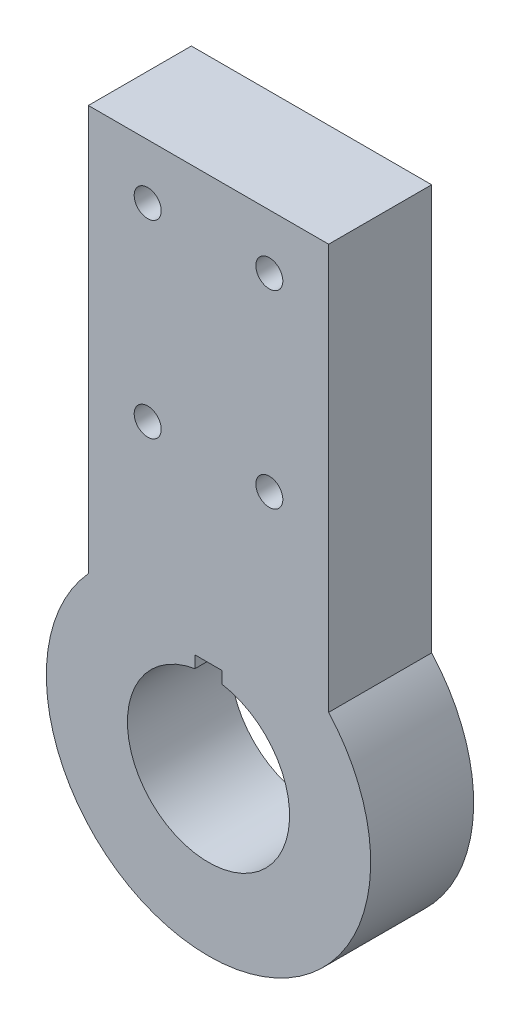
ISO-10303-21;
HEADER;
FILE_DESCRIPTION(('STEP AP214'),'2;1');
FILE_NAME('part.step','',(''),(''),'','','');
FILE_SCHEMA(('AUTOMOTIVE_DESIGN { 1 0 10303 214 1 1 1 1 }'));
ENDSEC;
DATA;
#1=APPLICATION_CONTEXT('core data for automotive mechanical design processes');
#2=APPLICATION_PROTOCOL_DEFINITION('international standard','automotive_design',2000,#1);
#3=PRODUCT_CONTEXT('',#1,'mechanical');
#4=PRODUCT('Part','Part','',(#3));
#5=PRODUCT_RELATED_PRODUCT_CATEGORY('part','',(#4));
#6=PRODUCT_DEFINITION_FORMATION('','',#4);
#7=PRODUCT_DEFINITION_CONTEXT('part definition',#1,'design');
#8=PRODUCT_DEFINITION('design','',#6,#7);
#9=PRODUCT_DEFINITION_SHAPE('','',#8);
#10=(LENGTH_UNIT() NAMED_UNIT(*) SI_UNIT(.MILLI.,.METRE.));
#11=(NAMED_UNIT(*) PLANE_ANGLE_UNIT() SI_UNIT($,.RADIAN.));
#12=(NAMED_UNIT(*) SI_UNIT($,.STERADIAN.) SOLID_ANGLE_UNIT());
#13=UNCERTAINTY_MEASURE_WITH_UNIT(LENGTH_MEASURE(1.E-05),#10,'distance_accuracy_value','');
#14=(GEOMETRIC_REPRESENTATION_CONTEXT(3) GLOBAL_UNCERTAINTY_ASSIGNED_CONTEXT((#13)) GLOBAL_UNIT_ASSIGNED_CONTEXT((#10,
#11,#12)) REPRESENTATION_CONTEXT('',''));
#15=CARTESIAN_POINT('',(0.,0.,0.));
#16=DIRECTION('',(0.,0.,1.));
#17=DIRECTION('',(1.,0.,0.));
#18=AXIS2_PLACEMENT_3D('',#15,#16,#17);
#19=CARTESIAN_POINT('',(0.,0.,19.05));
#20=DIRECTION('',(0.,0.,1.));
#21=DIRECTION('',(1.,0.,0.));
#22=AXIS2_PLACEMENT_3D('',#19,#20,#21);
#23=PLANE('',#22);
#24=CARTESIAN_POINT('',(-11.25,85.,19.05));
#25=DIRECTION('',(0.,0.,1.));
#26=DIRECTION('',(1.,0.,0.));
#27=AXIS2_PLACEMENT_3D('',#24,#25,#26);
#28=CIRCLE('',#27,2.5);
#29=CARTESIAN_POINT('',(-8.74999999999999,85.,19.05));
#30=VERTEX_POINT('',#29);
#31=EDGE_CURVE('E341',#30,#30,#28,.T.);
#32=ORIENTED_EDGE('',*,*,#31,.F.);
#33=EDGE_LOOP('',(#32));
#34=FACE_BOUND('',#33,.T.);
#35=CARTESIAN_POINT('',(11.25,50.,19.05));
#36=DIRECTION('',(0.,0.,1.));
#37=DIRECTION('',(1.,0.,0.));
#38=AXIS2_PLACEMENT_3D('',#35,#36,#37);
#39=CIRCLE('',#38,2.5);
#40=CARTESIAN_POINT('',(13.75,50.,19.05));
#41=VERTEX_POINT('',#40);
#42=EDGE_CURVE('E348',#41,#41,#39,.T.);
#43=ORIENTED_EDGE('',*,*,#42,.F.);
#44=EDGE_LOOP('',(#43));
#45=FACE_BOUND('',#44,.T.);
#46=CARTESIAN_POINT('',(-11.25,50.,19.05));
#47=DIRECTION('',(0.,0.,1.));
#48=DIRECTION('',(1.,0.,0.));
#49=AXIS2_PLACEMENT_3D('',#46,#47,#48);
#50=CIRCLE('',#49,2.5);
#51=CARTESIAN_POINT('',(-8.75000000000002,50.,19.05));
#52=VERTEX_POINT('',#51);
#53=EDGE_CURVE('E361',#52,#52,#50,.T.);
#54=ORIENTED_EDGE('',*,*,#53,.F.);
#55=EDGE_LOOP('',(#54));
#56=FACE_BOUND('',#55,.T.);
#57=CARTESIAN_POINT('',(11.25,85.,19.05));
#58=DIRECTION('',(0.,0.,1.));
#59=DIRECTION('',(1.,0.,0.));
#60=AXIS2_PLACEMENT_3D('',#57,#58,#59);
#61=CIRCLE('',#60,2.5);
#62=CARTESIAN_POINT('',(13.75,85.,19.05));
#63=VERTEX_POINT('',#62);
#64=EDGE_CURVE('E343',#63,#63,#61,.T.);
#65=ORIENTED_EDGE('',*,*,#64,.F.);
#66=EDGE_LOOP('',(#65));
#67=FACE_BOUND('',#66,.T.);
#68=DIRECTION('',(0.,-1.,0.));
#69=VECTOR('',#68,1.);
#70=CARTESIAN_POINT('',(-2.5,0.,19.05));
#71=LINE('',#70,#69);
#72=CARTESIAN_POINT('',(-2.5,17.,19.05));
#73=VERTEX_POINT('',#72);
#74=CARTESIAN_POINT('',(-2.5,14.790199457749,19.05));
#75=VERTEX_POINT('',#74);
#76=EDGE_CURVE('E149',#73,#75,#71,.T.);
#77=ORIENTED_EDGE('',*,*,#76,.F.);
#78=DIRECTION('',(-1.,0.,0.));
#79=VECTOR('',#78,1.);
#80=CARTESIAN_POINT('',(-2.5,17.,19.05));
#81=LINE('',#80,#79);
#82=CARTESIAN_POINT('',(2.5,17.,19.05));
#83=VERTEX_POINT('',#82);
#84=EDGE_CURVE('E145',#83,#73,#81,.T.);
#85=ORIENTED_EDGE('',*,*,#84,.F.);
#86=DIRECTION('',(0.,1.,0.));
#87=VECTOR('',#86,1.);
#88=CARTESIAN_POINT('',(2.5,17.,19.05));
#89=LINE('',#88,#87);
#90=CARTESIAN_POINT('',(2.5,14.790199457749,19.05));
#91=VERTEX_POINT('',#90);
#92=EDGE_CURVE('E122',#91,#83,#89,.T.);
#93=ORIENTED_EDGE('',*,*,#92,.F.);
#94=CARTESIAN_POINT('',(0.,0.,19.05));
#95=DIRECTION('',(0.,0.,1.));
#96=DIRECTION('',(1.,0.,0.));
#97=AXIS2_PLACEMENT_3D('',#94,#95,#96);
#98=CIRCLE('',#97,15.);
#99=EDGE_CURVE('E159',#75,#91,#98,.T.);
#100=ORIENTED_EDGE('',*,*,#99,.F.);
#101=EDGE_LOOP('',(#77,#85,#93,#100));
#102=FACE_BOUND('',#101,.T.);
#103=DIRECTION('',(0.,1.,0.));
#104=VECTOR('',#103,1.);
#105=CARTESIAN_POINT('',(22.225,20.1506668624143,19.05));
#106=LINE('',#105,#104);
#107=CARTESIAN_POINT('',(22.225,20.1506668624143,19.05));
#108=VERTEX_POINT('',#107);
#109=CARTESIAN_POINT('',(22.225,95.1506668624143,19.05));
#110=VERTEX_POINT('',#109);
#111=EDGE_CURVE('E166',#108,#110,#106,.T.);
#112=ORIENTED_EDGE('',*,*,#111,.T.);
#113=DIRECTION('',(-1.,0.,0.));
#114=VECTOR('',#113,1.);
#115=CARTESIAN_POINT('',(-22.225,95.1506668624143,19.05));
#116=LINE('',#115,#114);
#117=CARTESIAN_POINT('',(-22.225,95.1506668624143,19.05));
#118=VERTEX_POINT('',#117);
#119=EDGE_CURVE('E99',#110,#118,#116,.T.);
#120=ORIENTED_EDGE('',*,*,#119,.T.);
#121=DIRECTION('',(0.,-1.,0.));
#122=VECTOR('',#121,1.);
#123=CARTESIAN_POINT('',(-22.225,20.1506668624143,19.05));
#124=LINE('',#123,#122);
#125=CARTESIAN_POINT('',(-22.225,20.1506668624143,19.05));
#126=VERTEX_POINT('',#125);
#127=EDGE_CURVE('E171',#118,#126,#124,.T.);
#128=ORIENTED_EDGE('',*,*,#127,.T.);
#129=CARTESIAN_POINT('',(0.,0.,19.05));
#130=DIRECTION('',(0.,0.,1.));
#131=DIRECTION('',(1.,0.,0.));
#132=AXIS2_PLACEMENT_3D('',#129,#130,#131);
#133=CIRCLE('',#132,30.);
#134=EDGE_CURVE('E70',#126,#108,#133,.T.);
#135=ORIENTED_EDGE('',*,*,#134,.T.);
#136=EDGE_LOOP('',(#112,#120,#128,#135));
#137=FACE_BOUND('',#136,.T.);
#138=ADVANCED_FACE('F45',(#34,#45,#56,#67,#102,#137),#23,.T.);
#139=CARTESIAN_POINT('',(0.,0.,0.));
#140=DIRECTION('',(0.,0.,1.));
#141=DIRECTION('',(1.,0.,0.));
#142=AXIS2_PLACEMENT_3D('',#139,#140,#141);
#143=PLANE('',#142);
#144=CARTESIAN_POINT('',(-11.25,85.,0.));
#145=DIRECTION('',(0.,0.,1.));
#146=DIRECTION('',(1.,0.,0.));
#147=AXIS2_PLACEMENT_3D('',#144,#145,#146);
#148=CIRCLE('',#147,2.5);
#149=CARTESIAN_POINT('',(-8.74999999999999,85.,0.));
#150=VERTEX_POINT('',#149);
#151=EDGE_CURVE('E339',#150,#150,#148,.T.);
#152=ORIENTED_EDGE('',*,*,#151,.T.);
#153=EDGE_LOOP('',(#152));
#154=FACE_BOUND('',#153,.T.);
#155=CARTESIAN_POINT('',(11.25,50.,0.));
#156=DIRECTION('',(0.,0.,1.));
#157=DIRECTION('',(1.,0.,0.));
#158=AXIS2_PLACEMENT_3D('',#155,#156,#157);
#159=CIRCLE('',#158,2.5);
#160=CARTESIAN_POINT('',(13.75,50.,0.));
#161=VERTEX_POINT('',#160);
#162=EDGE_CURVE('E357',#161,#161,#159,.T.);
#163=ORIENTED_EDGE('',*,*,#162,.T.);
#164=EDGE_LOOP('',(#163));
#165=FACE_BOUND('',#164,.T.);
#166=CARTESIAN_POINT('',(-11.25,50.,0.));
#167=DIRECTION('',(0.,0.,1.));
#168=DIRECTION('',(1.,0.,0.));
#169=AXIS2_PLACEMENT_3D('',#166,#167,#168);
#170=CIRCLE('',#169,2.5);
#171=CARTESIAN_POINT('',(-8.75000000000002,50.,0.));
#172=VERTEX_POINT('',#171);
#173=EDGE_CURVE('E351',#172,#172,#170,.T.);
#174=ORIENTED_EDGE('',*,*,#173,.T.);
#175=EDGE_LOOP('',(#174));
#176=FACE_BOUND('',#175,.T.);
#177=CARTESIAN_POINT('',(11.25,85.,0.));
#178=DIRECTION('',(0.,0.,1.));
#179=DIRECTION('',(1.,0.,0.));
#180=AXIS2_PLACEMENT_3D('',#177,#178,#179);
#181=CIRCLE('',#180,2.5);
#182=CARTESIAN_POINT('',(13.75,85.,0.));
#183=VERTEX_POINT('',#182);
#184=EDGE_CURVE('E152',#183,#183,#181,.T.);
#185=ORIENTED_EDGE('',*,*,#184,.T.);
#186=EDGE_LOOP('',(#185));
#187=FACE_BOUND('',#186,.T.);
#188=DIRECTION('',(0.,1.,0.));
#189=VECTOR('',#188,1.);
#190=CARTESIAN_POINT('',(22.225,20.1506668624143,0.));
#191=LINE('',#190,#189);
#192=CARTESIAN_POINT('',(22.225,20.1506668624143,0.));
#193=VERTEX_POINT('',#192);
#194=CARTESIAN_POINT('',(22.225,95.1506668624143,0.));
#195=VERTEX_POINT('',#194);
#196=EDGE_CURVE('E163',#193,#195,#191,.T.);
#197=ORIENTED_EDGE('',*,*,#196,.F.);
#198=CARTESIAN_POINT('',(0.,0.,0.));
#199=DIRECTION('',(0.,0.,1.));
#200=DIRECTION('',(1.,0.,0.));
#201=AXIS2_PLACEMENT_3D('',#198,#199,#200);
#202=CIRCLE('',#201,30.);
#203=CARTESIAN_POINT('',(-22.225,20.1506668624143,0.));
#204=VERTEX_POINT('',#203);
#205=EDGE_CURVE('E91',#204,#193,#202,.T.);
#206=ORIENTED_EDGE('',*,*,#205,.F.);
#207=DIRECTION('',(0.,-1.,0.));
#208=VECTOR('',#207,1.);
#209=CARTESIAN_POINT('',(-22.225,20.1506668624143,0.));
#210=LINE('',#209,#208);
#211=CARTESIAN_POINT('',(-22.225,95.1506668624143,0.));
#212=VERTEX_POINT('',#211);
#213=EDGE_CURVE('E183',#212,#204,#210,.T.);
#214=ORIENTED_EDGE('',*,*,#213,.F.);
#215=DIRECTION('',(-1.,0.,0.));
#216=VECTOR('',#215,1.);
#217=CARTESIAN_POINT('',(-22.225,95.1506668624143,0.));
#218=LINE('',#217,#216);
#219=EDGE_CURVE('E180',#195,#212,#218,.T.);
#220=ORIENTED_EDGE('',*,*,#219,.F.);
#221=EDGE_LOOP('',(#197,#206,#214,#220));
#222=FACE_BOUND('',#221,.T.);
#223=DIRECTION('',(-1.,0.,0.));
#224=VECTOR('',#223,1.);
#225=CARTESIAN_POINT('',(-2.5,17.,0.));
#226=LINE('',#225,#224);
#227=CARTESIAN_POINT('',(2.5,17.,0.));
#228=VERTEX_POINT('',#227);
#229=CARTESIAN_POINT('',(-2.5,17.,0.));
#230=VERTEX_POINT('',#229);
#231=EDGE_CURVE('E128',#228,#230,#226,.T.);
#232=ORIENTED_EDGE('',*,*,#231,.T.);
#233=DIRECTION('',(0.,-1.,0.));
#234=VECTOR('',#233,1.);
#235=CARTESIAN_POINT('',(-2.5,0.,0.));
#236=LINE('',#235,#234);
#237=CARTESIAN_POINT('',(-2.5,14.790199457749,0.));
#238=VERTEX_POINT('',#237);
#239=EDGE_CURVE('E142',#230,#238,#236,.T.);
#240=ORIENTED_EDGE('',*,*,#239,.T.);
#241=CARTESIAN_POINT('',(0.,0.,0.));
#242=DIRECTION('',(0.,0.,1.));
#243=DIRECTION('',(1.,0.,0.));
#244=AXIS2_PLACEMENT_3D('',#241,#242,#243);
#245=CIRCLE('',#244,15.);
#246=CARTESIAN_POINT('',(2.5,14.790199457749,0.));
#247=VERTEX_POINT('',#246);
#248=EDGE_CURVE('E140',#238,#247,#245,.T.);
#249=ORIENTED_EDGE('',*,*,#248,.T.);
#250=DIRECTION('',(0.,1.,0.));
#251=VECTOR('',#250,1.);
#252=CARTESIAN_POINT('',(2.5,17.,0.));
#253=LINE('',#252,#251);
#254=EDGE_CURVE('E61',#247,#228,#253,.T.);
#255=ORIENTED_EDGE('',*,*,#254,.T.);
#256=EDGE_LOOP('',(#232,#240,#249,#255));
#257=FACE_BOUND('',#256,.T.);
#258=ADVANCED_FACE('F138',(#154,#165,#176,#187,#222,#257),#143,.F.);
#259=CARTESIAN_POINT('',(22.225,20.1506668624143,19.05));
#260=DIRECTION('',(-1.,0.,0.));
#261=DIRECTION('',(0.,-1.,0.));
#262=AXIS2_PLACEMENT_3D('',#259,#260,#261);
#263=PLANE('',#262);
#264=ORIENTED_EDGE('',*,*,#196,.T.);
#265=DIRECTION('',(0.,0.,-1.));
#266=VECTOR('',#265,1.);
#267=CARTESIAN_POINT('',(22.225,95.1506668624143,19.05));
#268=LINE('',#267,#266);
#269=EDGE_CURVE('E197',#110,#195,#268,.T.);
#270=ORIENTED_EDGE('',*,*,#269,.F.);
#271=ORIENTED_EDGE('',*,*,#111,.F.);
#272=DIRECTION('',(0.,0.,-1.));
#273=VECTOR('',#272,1.);
#274=CARTESIAN_POINT('',(22.225,20.1506668624143,19.05));
#275=LINE('',#274,#273);
#276=EDGE_CURVE('E176',#108,#193,#275,.T.);
#277=ORIENTED_EDGE('',*,*,#276,.T.);
#278=EDGE_LOOP('',(#264,#270,#271,#277));
#279=FACE_BOUND('',#278,.T.);
#280=ADVANCED_FACE('F47',(#279),#263,.F.);
#281=CARTESIAN_POINT('',(-22.225,95.1506668624143,19.05));
#282=DIRECTION('',(0.,-1.,0.));
#283=DIRECTION('',(0.,0.,-1.));
#284=AXIS2_PLACEMENT_3D('',#281,#282,#283);
#285=PLANE('',#284);
#286=ORIENTED_EDGE('',*,*,#219,.T.);
#287=DIRECTION('',(0.,0.,-1.));
#288=VECTOR('',#287,1.);
#289=CARTESIAN_POINT('',(-22.225,95.1506668624143,19.05));
#290=LINE('',#289,#288);
#291=EDGE_CURVE('E193',#118,#212,#290,.T.);
#292=ORIENTED_EDGE('',*,*,#291,.F.);
#293=ORIENTED_EDGE('',*,*,#119,.F.);
#294=ORIENTED_EDGE('',*,*,#269,.T.);
#295=EDGE_LOOP('',(#286,#292,#293,#294));
#296=FACE_BOUND('',#295,.T.);
#297=ADVANCED_FACE('F234',(#296),#285,.F.);
#298=CARTESIAN_POINT('',(-22.225,20.1506668624143,19.05));
#299=DIRECTION('',(1.,0.,0.));
#300=DIRECTION('',(0.,0.,-1.));
#301=AXIS2_PLACEMENT_3D('',#298,#299,#300);
#302=PLANE('',#301);
#303=ORIENTED_EDGE('',*,*,#213,.T.);
#304=DIRECTION('',(0.,0.,-1.));
#305=VECTOR('',#304,1.);
#306=CARTESIAN_POINT('',(-22.225,20.1506668624143,19.05));
#307=LINE('',#306,#305);
#308=EDGE_CURVE('E190',#126,#204,#307,.T.);
#309=ORIENTED_EDGE('',*,*,#308,.F.);
#310=ORIENTED_EDGE('',*,*,#127,.F.);
#311=ORIENTED_EDGE('',*,*,#291,.T.);
#312=EDGE_LOOP('',(#303,#309,#310,#311));
#313=FACE_BOUND('',#312,.T.);
#314=ADVANCED_FACE('F232',(#313),#302,.F.);
#315=CARTESIAN_POINT('',(0.,0.,19.05));
#316=DIRECTION('',(0.,0.,-1.));
#317=DIRECTION('',(-1.,0.,0.));
#318=AXIS2_PLACEMENT_3D('',#315,#316,#317);
#319=CYLINDRICAL_SURFACE('',#318,30.);
#320=ORIENTED_EDGE('',*,*,#205,.T.);
#321=ORIENTED_EDGE('',*,*,#276,.F.);
#322=ORIENTED_EDGE('',*,*,#134,.F.);
#323=ORIENTED_EDGE('',*,*,#308,.T.);
#324=EDGE_LOOP('',(#320,#321,#322,#323));
#325=FACE_BOUND('',#324,.T.);
#326=ADVANCED_FACE('F215',(#325),#319,.T.);
#327=CARTESIAN_POINT('',(0.,0.,19.05));
#328=DIRECTION('',(0.,0.,-1.));
#329=DIRECTION('',(-1.,0.,0.));
#330=AXIS2_PLACEMENT_3D('',#327,#328,#329);
#331=CYLINDRICAL_SURFACE('',#330,15.);
#332=DIRECTION('',(0.,0.,-1.));
#333=VECTOR('',#332,1.);
#334=CARTESIAN_POINT('',(-2.5,14.790199457749,19.05));
#335=LINE('',#334,#333);
#336=EDGE_CURVE('E11',#75,#238,#335,.T.);
#337=ORIENTED_EDGE('',*,*,#336,.F.);
#338=ORIENTED_EDGE('',*,*,#99,.T.);
#339=DIRECTION('',(0.,0.,-1.));
#340=VECTOR('',#339,1.);
#341=CARTESIAN_POINT('',(2.5,14.790199457749,19.05));
#342=LINE('',#341,#340);
#343=EDGE_CURVE('E54',#247,#91,#342,.F.);
#344=ORIENTED_EDGE('',*,*,#343,.F.);
#345=ORIENTED_EDGE('',*,*,#248,.F.);
#346=EDGE_LOOP('',(#337,#338,#344,#345));
#347=FACE_BOUND('',#346,.T.);
#348=ADVANCED_FACE('F205',(#347),#331,.F.);
#349=CARTESIAN_POINT('',(-2.5,0.,0.));
#350=DIRECTION('',(-1.,0.,0.));
#351=DIRECTION('',(0.,-1.,0.));
#352=AXIS2_PLACEMENT_3D('',#349,#350,#351);
#353=PLANE('',#352);
#354=ORIENTED_EDGE('',*,*,#336,.T.);
#355=ORIENTED_EDGE('',*,*,#239,.F.);
#356=DIRECTION('',(0.,0.,1.));
#357=VECTOR('',#356,1.);
#358=CARTESIAN_POINT('',(-2.5,17.,0.));
#359=LINE('',#358,#357);
#360=EDGE_CURVE('E127',#230,#73,#359,.T.);
#361=ORIENTED_EDGE('',*,*,#360,.T.);
#362=ORIENTED_EDGE('',*,*,#76,.T.);
#363=EDGE_LOOP('',(#354,#355,#361,#362));
#364=FACE_BOUND('',#363,.T.);
#365=ADVANCED_FACE('F207',(#364),#353,.F.);
#366=CARTESIAN_POINT('',(-2.5,17.,0.));
#367=DIRECTION('',(0.,1.,0.));
#368=DIRECTION('',(0.,0.,1.));
#369=AXIS2_PLACEMENT_3D('',#366,#367,#368);
#370=PLANE('',#369);
#371=ORIENTED_EDGE('',*,*,#84,.T.);
#372=ORIENTED_EDGE('',*,*,#360,.F.);
#373=ORIENTED_EDGE('',*,*,#231,.F.);
#374=DIRECTION('',(0.,0.,1.));
#375=VECTOR('',#374,1.);
#376=CARTESIAN_POINT('',(2.5,17.,0.));
#377=LINE('',#376,#375);
#378=EDGE_CURVE('E118',#228,#83,#377,.T.);
#379=ORIENTED_EDGE('',*,*,#378,.T.);
#380=EDGE_LOOP('',(#371,#372,#373,#379));
#381=FACE_BOUND('',#380,.T.);
#382=ADVANCED_FACE('F131',(#381),#370,.F.);
#383=CARTESIAN_POINT('',(2.5,17.,0.));
#384=DIRECTION('',(1.,0.,0.));
#385=DIRECTION('',(0.,1.,0.));
#386=AXIS2_PLACEMENT_3D('',#383,#384,#385);
#387=PLANE('',#386);
#388=ORIENTED_EDGE('',*,*,#343,.T.);
#389=ORIENTED_EDGE('',*,*,#92,.T.);
#390=ORIENTED_EDGE('',*,*,#378,.F.);
#391=ORIENTED_EDGE('',*,*,#254,.F.);
#392=EDGE_LOOP('',(#388,#389,#390,#391));
#393=FACE_BOUND('',#392,.T.);
#394=ADVANCED_FACE('F120',(#393),#387,.F.);
#395=CARTESIAN_POINT('',(11.25,85.,0.));
#396=DIRECTION('',(0.,0.,1.));
#397=DIRECTION('',(1.,0.,0.));
#398=AXIS2_PLACEMENT_3D('',#395,#396,#397);
#399=CYLINDRICAL_SURFACE('',#398,2.5);
#400=CARTESIAN_POINT('',(13.75,85.,0.));
#401=CARTESIAN_POINT('',(13.75,85.,0.1984375));
#402=CARTESIAN_POINT('',(13.75,85.,0.396875));
#403=CARTESIAN_POINT('',(13.75,85.,0.79375));
#404=CARTESIAN_POINT('',(13.75,85.,0.9921875));
#405=CARTESIAN_POINT('',(13.75,85.,1.3890625));
#406=CARTESIAN_POINT('',(13.75,85.,1.5875));
#407=CARTESIAN_POINT('',(13.75,85.,1.984375));
#408=CARTESIAN_POINT('',(13.75,85.,2.1828125));
#409=CARTESIAN_POINT('',(13.75,85.,2.5796875));
#410=CARTESIAN_POINT('',(13.75,85.,2.778125));
#411=CARTESIAN_POINT('',(13.75,85.,3.175));
#412=CARTESIAN_POINT('',(13.75,85.,3.3734375));
#413=CARTESIAN_POINT('',(13.75,85.,3.7703125));
#414=CARTESIAN_POINT('',(13.75,85.,3.96875));
#415=CARTESIAN_POINT('',(13.75,85.,4.365625));
#416=CARTESIAN_POINT('',(13.75,85.,4.5640625));
#417=CARTESIAN_POINT('',(13.75,85.,4.9609375));
#418=CARTESIAN_POINT('',(13.75,85.,5.159375));
#419=CARTESIAN_POINT('',(13.75,85.,5.55625));
#420=CARTESIAN_POINT('',(13.75,85.,5.7546875));
#421=CARTESIAN_POINT('',(13.75,85.,6.1515625));
#422=CARTESIAN_POINT('',(13.75,85.,6.35));
#423=CARTESIAN_POINT('',(13.75,85.,6.746875));
#424=CARTESIAN_POINT('',(13.75,85.,6.9453125));
#425=CARTESIAN_POINT('',(13.75,85.,7.3421875));
#426=CARTESIAN_POINT('',(13.75,85.,7.540625));
#427=CARTESIAN_POINT('',(13.75,85.,7.9375));
#428=CARTESIAN_POINT('',(13.75,85.,8.1359375));
#429=CARTESIAN_POINT('',(13.75,85.,8.5328125));
#430=CARTESIAN_POINT('',(13.75,85.,8.73125));
#431=CARTESIAN_POINT('',(13.75,85.,9.128125));
#432=CARTESIAN_POINT('',(13.75,85.,9.3265625));
#433=CARTESIAN_POINT('',(13.75,85.,9.7234375));
#434=CARTESIAN_POINT('',(13.75,85.,9.921875));
#435=CARTESIAN_POINT('',(13.75,85.,10.31875));
#436=CARTESIAN_POINT('',(13.75,85.,10.5171875));
#437=CARTESIAN_POINT('',(13.75,85.,10.9140625));
#438=CARTESIAN_POINT('',(13.75,85.,11.1125));
#439=CARTESIAN_POINT('',(13.75,85.,11.509375));
#440=CARTESIAN_POINT('',(13.75,85.,11.7078125));
#441=CARTESIAN_POINT('',(13.75,85.,12.1046875));
#442=CARTESIAN_POINT('',(13.75,85.,12.303125));
#443=CARTESIAN_POINT('',(13.75,85.,12.7));
#444=CARTESIAN_POINT('',(13.75,85.,12.8984375));
#445=CARTESIAN_POINT('',(13.75,85.,13.2953125));
#446=CARTESIAN_POINT('',(13.75,85.,13.49375));
#447=CARTESIAN_POINT('',(13.75,85.,13.890625));
#448=CARTESIAN_POINT('',(13.75,85.,14.0890625));
#449=CARTESIAN_POINT('',(13.75,85.,14.4859375));
#450=CARTESIAN_POINT('',(13.75,85.,14.684375));
#451=CARTESIAN_POINT('',(13.75,85.,15.08125));
#452=CARTESIAN_POINT('',(13.75,85.,15.2796875));
#453=CARTESIAN_POINT('',(13.75,85.,15.6765625));
#454=CARTESIAN_POINT('',(13.75,85.,15.875));
#455=CARTESIAN_POINT('',(13.75,85.,16.271875));
#456=CARTESIAN_POINT('',(13.75,85.,16.4703125));
#457=CARTESIAN_POINT('',(13.75,85.,16.8671875));
#458=CARTESIAN_POINT('',(13.75,85.,17.065625));
#459=CARTESIAN_POINT('',(13.75,85.,17.4625));
#460=CARTESIAN_POINT('',(13.75,85.,17.6609375));
#461=CARTESIAN_POINT('',(13.75,85.,18.0578125));
#462=CARTESIAN_POINT('',(13.75,85.,18.25625));
#463=CARTESIAN_POINT('',(13.75,85.,18.653125));
#464=CARTESIAN_POINT('',(13.75,85.,18.8515625));
#465=CARTESIAN_POINT('',(13.75,85.,19.05));
#466=B_SPLINE_CURVE_WITH_KNOTS('',3,(#400,#401,#402,#403,#404,#405,#406,#407,#408,#409,#410,
#411,#412,#413,#414,#415,#416,#417,#418,#419,#420,#421,#422,#423,#424,#425,#426,#427,#428,#429,
#430,#431,#432,#433,#434,#435,#436,#437,#438,#439,#440,#441,#442,#443,#444,#445,#446,#447,#448,
#449,#450,#451,#452,#453,#454,#455,#456,#457,#458,#459,#460,#461,#462,#463,#464,#465),
.UNSPECIFIED.,.F.,.F.,(4,2,2,2,2,2,2,2,2,2,2,2,2,2,2,2,2,2,2,2,2,2,2,2,2,2,2,2,2,2,2,2,4),(0.,
0.5953125,1.190625,1.7859375,2.38125,2.9765625,3.571875,4.1671875,4.7625,5.3578125,5.953125,
6.5484375,7.14375,7.7390625,8.334375,8.9296875,9.525,10.1203125,10.715625,11.3109375,11.90625,
12.5015625,13.096875,13.6921875,14.2875,14.8828125,15.478125,16.0734375,16.66875,17.2640625,
17.859375,18.4546875,19.05),.UNSPECIFIED.);
#467=EDGE_CURVE('BSEAM295',#183,#63,#466,.T.);
#468=ORIENTED_EDGE('',*,*,#184,.F.);
#469=ORIENTED_EDGE('',*,*,#64,.T.);
#470=ORIENTED_EDGE('',*,*,#467,.T.);
#471=ORIENTED_EDGE('',*,*,#467,.F.);
#472=EDGE_LOOP('',(#468,#470,#469,#471));
#473=FACE_BOUND('',#472,.T.);
#474=ADVANCED_FACE('F295',(#473),#399,.F.);
#475=CARTESIAN_POINT('',(-11.25,50.,0.));
#476=DIRECTION('',(0.,0.,1.));
#477=DIRECTION('',(1.,0.,0.));
#478=AXIS2_PLACEMENT_3D('',#475,#476,#477);
#479=CYLINDRICAL_SURFACE('',#478,2.5);
#480=CARTESIAN_POINT('',(-8.75000000000002,50.,0.));
#481=CARTESIAN_POINT('',(-8.75000000000002,50.,0.1984375));
#482=CARTESIAN_POINT('',(-8.75000000000002,50.,0.396875));
#483=CARTESIAN_POINT('',(-8.75000000000002,50.,0.79375));
#484=CARTESIAN_POINT('',(-8.75000000000002,50.,0.9921875));
#485=CARTESIAN_POINT('',(-8.75000000000002,50.,1.3890625));
#486=CARTESIAN_POINT('',(-8.75000000000002,50.,1.5875));
#487=CARTESIAN_POINT('',(-8.75000000000002,50.,1.984375));
#488=CARTESIAN_POINT('',(-8.75000000000002,50.,2.1828125));
#489=CARTESIAN_POINT('',(-8.75000000000002,50.,2.5796875));
#490=CARTESIAN_POINT('',(-8.75000000000002,50.,2.778125));
#491=CARTESIAN_POINT('',(-8.75000000000002,50.,3.175));
#492=CARTESIAN_POINT('',(-8.75000000000002,50.,3.3734375));
#493=CARTESIAN_POINT('',(-8.75000000000002,50.,3.7703125));
#494=CARTESIAN_POINT('',(-8.75000000000002,50.,3.96875));
#495=CARTESIAN_POINT('',(-8.75000000000002,50.,4.365625));
#496=CARTESIAN_POINT('',(-8.75000000000002,50.,4.5640625));
#497=CARTESIAN_POINT('',(-8.75000000000002,50.,4.9609375));
#498=CARTESIAN_POINT('',(-8.75000000000002,50.,5.159375));
#499=CARTESIAN_POINT('',(-8.75000000000002,50.,5.55625));
#500=CARTESIAN_POINT('',(-8.75000000000002,50.,5.7546875));
#501=CARTESIAN_POINT('',(-8.75000000000002,50.,6.1515625));
#502=CARTESIAN_POINT('',(-8.75000000000002,50.,6.35));
#503=CARTESIAN_POINT('',(-8.75000000000002,50.,6.746875));
#504=CARTESIAN_POINT('',(-8.75000000000002,50.,6.9453125));
#505=CARTESIAN_POINT('',(-8.75000000000002,50.,7.3421875));
#506=CARTESIAN_POINT('',(-8.75000000000002,50.,7.540625));
#507=CARTESIAN_POINT('',(-8.75000000000002,50.,7.9375));
#508=CARTESIAN_POINT('',(-8.75000000000002,50.,8.1359375));
#509=CARTESIAN_POINT('',(-8.75000000000002,50.,8.5328125));
#510=CARTESIAN_POINT('',(-8.75000000000002,50.,8.73125));
#511=CARTESIAN_POINT('',(-8.75000000000002,50.,9.128125));
#512=CARTESIAN_POINT('',(-8.75000000000002,50.,9.3265625));
#513=CARTESIAN_POINT('',(-8.75000000000002,50.,9.7234375));
#514=CARTESIAN_POINT('',(-8.75000000000002,50.,9.921875));
#515=CARTESIAN_POINT('',(-8.75000000000002,50.,10.31875));
#516=CARTESIAN_POINT('',(-8.75000000000002,50.,10.5171875));
#517=CARTESIAN_POINT('',(-8.75000000000002,50.,10.9140625));
#518=CARTESIAN_POINT('',(-8.75000000000002,50.,11.1125));
#519=CARTESIAN_POINT('',(-8.75000000000002,50.,11.509375));
#520=CARTESIAN_POINT('',(-8.75000000000002,50.,11.7078125));
#521=CARTESIAN_POINT('',(-8.75000000000002,50.,12.1046875));
#522=CARTESIAN_POINT('',(-8.75000000000002,50.,12.303125));
#523=CARTESIAN_POINT('',(-8.75000000000002,50.,12.7));
#524=CARTESIAN_POINT('',(-8.75000000000002,50.,12.8984375));
#525=CARTESIAN_POINT('',(-8.75000000000002,50.,13.2953125));
#526=CARTESIAN_POINT('',(-8.75000000000002,50.,13.49375));
#527=CARTESIAN_POINT('',(-8.75000000000002,50.,13.890625));
#528=CARTESIAN_POINT('',(-8.75000000000002,50.,14.0890625));
#529=CARTESIAN_POINT('',(-8.75000000000002,50.,14.4859375));
#530=CARTESIAN_POINT('',(-8.75000000000002,50.,14.684375));
#531=CARTESIAN_POINT('',(-8.75000000000002,50.,15.08125));
#532=CARTESIAN_POINT('',(-8.75000000000002,50.,15.2796875));
#533=CARTESIAN_POINT('',(-8.75000000000002,50.,15.6765625));
#534=CARTESIAN_POINT('',(-8.75000000000002,50.,15.875));
#535=CARTESIAN_POINT('',(-8.75000000000002,50.,16.271875));
#536=CARTESIAN_POINT('',(-8.75000000000002,50.,16.4703125));
#537=CARTESIAN_POINT('',(-8.75000000000002,50.,16.8671875));
#538=CARTESIAN_POINT('',(-8.75000000000002,50.,17.065625));
#539=CARTESIAN_POINT('',(-8.75000000000002,50.,17.4625));
#540=CARTESIAN_POINT('',(-8.75000000000002,50.,17.6609375));
#541=CARTESIAN_POINT('',(-8.75000000000002,50.,18.0578125));
#542=CARTESIAN_POINT('',(-8.75000000000002,50.,18.25625));
#543=CARTESIAN_POINT('',(-8.75000000000002,50.,18.653125));
#544=CARTESIAN_POINT('',(-8.75000000000002,50.,18.8515625));
#545=CARTESIAN_POINT('',(-8.75000000000002,50.,19.05));
#546=B_SPLINE_CURVE_WITH_KNOTS('',3,(#480,#481,#482,#483,#484,#485,#486,#487,#488,#489,#490,
#491,#492,#493,#494,#495,#496,#497,#498,#499,#500,#501,#502,#503,#504,#505,#506,#507,#508,#509,
#510,#511,#512,#513,#514,#515,#516,#517,#518,#519,#520,#521,#522,#523,#524,#525,#526,#527,#528,
#529,#530,#531,#532,#533,#534,#535,#536,#537,#538,#539,#540,#541,#542,#543,#544,#545),
.UNSPECIFIED.,.F.,.F.,(4,2,2,2,2,2,2,2,2,2,2,2,2,2,2,2,2,2,2,2,2,2,2,2,2,2,2,2,2,2,2,2,4),(0.,
0.5953125,1.190625,1.7859375,2.38125,2.9765625,3.571875,4.1671875,4.7625,5.3578125,5.953125,
6.5484375,7.14375,7.7390625,8.334375,8.9296875,9.525,10.1203125,10.715625,11.3109375,11.90625,
12.5015625,13.096875,13.6921875,14.2875,14.8828125,15.478125,16.0734375,16.66875,17.2640625,
17.859375,18.4546875,19.05),.UNSPECIFIED.);
#547=EDGE_CURVE('BSEAM303',#172,#52,#546,.T.);
#548=ORIENTED_EDGE('',*,*,#173,.F.);
#549=ORIENTED_EDGE('',*,*,#53,.T.);
#550=ORIENTED_EDGE('',*,*,#547,.T.);
#551=ORIENTED_EDGE('',*,*,#547,.F.);
#552=EDGE_LOOP('',(#548,#550,#549,#551));
#553=FACE_BOUND('',#552,.T.);
#554=ADVANCED_FACE('F303',(#553),#479,.F.);
#555=CARTESIAN_POINT('',(11.25,50.,0.));
#556=DIRECTION('',(0.,0.,1.));
#557=DIRECTION('',(1.,0.,0.));
#558=AXIS2_PLACEMENT_3D('',#555,#556,#557);
#559=CYLINDRICAL_SURFACE('',#558,2.5);
#560=CARTESIAN_POINT('',(13.75,50.,0.));
#561=CARTESIAN_POINT('',(13.75,50.,0.1984375));
#562=CARTESIAN_POINT('',(13.75,50.,0.396875));
#563=CARTESIAN_POINT('',(13.75,50.,0.79375));
#564=CARTESIAN_POINT('',(13.75,50.,0.9921875));
#565=CARTESIAN_POINT('',(13.75,50.,1.3890625));
#566=CARTESIAN_POINT('',(13.75,50.,1.5875));
#567=CARTESIAN_POINT('',(13.75,50.,1.984375));
#568=CARTESIAN_POINT('',(13.75,50.,2.1828125));
#569=CARTESIAN_POINT('',(13.75,50.,2.5796875));
#570=CARTESIAN_POINT('',(13.75,50.,2.778125));
#571=CARTESIAN_POINT('',(13.75,50.,3.175));
#572=CARTESIAN_POINT('',(13.75,50.,3.3734375));
#573=CARTESIAN_POINT('',(13.75,50.,3.7703125));
#574=CARTESIAN_POINT('',(13.75,50.,3.96875));
#575=CARTESIAN_POINT('',(13.75,50.,4.365625));
#576=CARTESIAN_POINT('',(13.75,50.,4.5640625));
#577=CARTESIAN_POINT('',(13.75,50.,4.9609375));
#578=CARTESIAN_POINT('',(13.75,50.,5.159375));
#579=CARTESIAN_POINT('',(13.75,50.,5.55625));
#580=CARTESIAN_POINT('',(13.75,50.,5.7546875));
#581=CARTESIAN_POINT('',(13.75,50.,6.1515625));
#582=CARTESIAN_POINT('',(13.75,50.,6.35));
#583=CARTESIAN_POINT('',(13.75,50.,6.746875));
#584=CARTESIAN_POINT('',(13.75,50.,6.9453125));
#585=CARTESIAN_POINT('',(13.75,50.,7.3421875));
#586=CARTESIAN_POINT('',(13.75,50.,7.540625));
#587=CARTESIAN_POINT('',(13.75,50.,7.9375));
#588=CARTESIAN_POINT('',(13.75,50.,8.1359375));
#589=CARTESIAN_POINT('',(13.75,50.,8.5328125));
#590=CARTESIAN_POINT('',(13.75,50.,8.73125));
#591=CARTESIAN_POINT('',(13.75,50.,9.128125));
#592=CARTESIAN_POINT('',(13.75,50.,9.3265625));
#593=CARTESIAN_POINT('',(13.75,50.,9.7234375));
#594=CARTESIAN_POINT('',(13.75,50.,9.921875));
#595=CARTESIAN_POINT('',(13.75,50.,10.31875));
#596=CARTESIAN_POINT('',(13.75,50.,10.5171875));
#597=CARTESIAN_POINT('',(13.75,50.,10.9140625));
#598=CARTESIAN_POINT('',(13.75,50.,11.1125));
#599=CARTESIAN_POINT('',(13.75,50.,11.509375));
#600=CARTESIAN_POINT('',(13.75,50.,11.7078125));
#601=CARTESIAN_POINT('',(13.75,50.,12.1046875));
#602=CARTESIAN_POINT('',(13.75,50.,12.303125));
#603=CARTESIAN_POINT('',(13.75,50.,12.7));
#604=CARTESIAN_POINT('',(13.75,50.,12.8984375));
#605=CARTESIAN_POINT('',(13.75,50.,13.2953125));
#606=CARTESIAN_POINT('',(13.75,50.,13.49375));
#607=CARTESIAN_POINT('',(13.75,50.,13.890625));
#608=CARTESIAN_POINT('',(13.75,50.,14.0890625));
#609=CARTESIAN_POINT('',(13.75,50.,14.4859375));
#610=CARTESIAN_POINT('',(13.75,50.,14.684375));
#611=CARTESIAN_POINT('',(13.75,50.,15.08125));
#612=CARTESIAN_POINT('',(13.75,50.,15.2796875));
#613=CARTESIAN_POINT('',(13.75,50.,15.6765625));
#614=CARTESIAN_POINT('',(13.75,50.,15.875));
#615=CARTESIAN_POINT('',(13.75,50.,16.271875));
#616=CARTESIAN_POINT('',(13.75,50.,16.4703125));
#617=CARTESIAN_POINT('',(13.75,50.,16.8671875));
#618=CARTESIAN_POINT('',(13.75,50.,17.065625));
#619=CARTESIAN_POINT('',(13.75,50.,17.4625));
#620=CARTESIAN_POINT('',(13.75,50.,17.6609375));
#621=CARTESIAN_POINT('',(13.75,50.,18.0578125));
#622=CARTESIAN_POINT('',(13.75,50.,18.25625));
#623=CARTESIAN_POINT('',(13.75,50.,18.653125));
#624=CARTESIAN_POINT('',(13.75,50.,18.8515625));
#625=CARTESIAN_POINT('',(13.75,50.,19.05));
#626=B_SPLINE_CURVE_WITH_KNOTS('',3,(#560,#561,#562,#563,#564,#565,#566,#567,#568,#569,#570,
#571,#572,#573,#574,#575,#576,#577,#578,#579,#580,#581,#582,#583,#584,#585,#586,#587,#588,#589,
#590,#591,#592,#593,#594,#595,#596,#597,#598,#599,#600,#601,#602,#603,#604,#605,#606,#607,#608,
#609,#610,#611,#612,#613,#614,#615,#616,#617,#618,#619,#620,#621,#622,#623,#624,#625),
.UNSPECIFIED.,.F.,.F.,(4,2,2,2,2,2,2,2,2,2,2,2,2,2,2,2,2,2,2,2,2,2,2,2,2,2,2,2,2,2,2,2,4),(0.,
0.5953125,1.190625,1.7859375,2.38125,2.9765625,3.571875,4.1671875,4.7625,5.3578125,5.953125,
6.5484375,7.14375,7.7390625,8.334375,8.9296875,9.525,10.1203125,10.715625,11.3109375,11.90625,
12.5015625,13.096875,13.6921875,14.2875,14.8828125,15.478125,16.0734375,16.66875,17.2640625,
17.859375,18.4546875,19.05),.UNSPECIFIED.);
#627=EDGE_CURVE('BSEAM313',#161,#41,#626,.T.);
#628=ORIENTED_EDGE('',*,*,#162,.F.);
#629=ORIENTED_EDGE('',*,*,#42,.T.);
#630=ORIENTED_EDGE('',*,*,#627,.T.);
#631=ORIENTED_EDGE('',*,*,#627,.F.);
#632=EDGE_LOOP('',(#628,#630,#629,#631));
#633=FACE_BOUND('',#632,.T.);
#634=ADVANCED_FACE('F313',(#633),#559,.F.);
#635=CARTESIAN_POINT('',(-11.25,85.,0.));
#636=DIRECTION('',(0.,0.,1.));
#637=DIRECTION('',(1.,0.,0.));
#638=AXIS2_PLACEMENT_3D('',#635,#636,#637);
#639=CYLINDRICAL_SURFACE('',#638,2.5);
#640=CARTESIAN_POINT('',(-8.74999999999999,85.,0.));
#641=CARTESIAN_POINT('',(-8.74999999999999,85.,0.1984375));
#642=CARTESIAN_POINT('',(-8.74999999999999,85.,0.396875));
#643=CARTESIAN_POINT('',(-8.74999999999999,85.,0.79375));
#644=CARTESIAN_POINT('',(-8.74999999999999,85.,0.9921875));
#645=CARTESIAN_POINT('',(-8.74999999999999,85.,1.3890625));
#646=CARTESIAN_POINT('',(-8.74999999999999,85.,1.5875));
#647=CARTESIAN_POINT('',(-8.74999999999999,85.,1.984375));
#648=CARTESIAN_POINT('',(-8.74999999999999,85.,2.1828125));
#649=CARTESIAN_POINT('',(-8.74999999999999,85.,2.5796875));
#650=CARTESIAN_POINT('',(-8.74999999999999,85.,2.778125));
#651=CARTESIAN_POINT('',(-8.74999999999999,85.,3.175));
#652=CARTESIAN_POINT('',(-8.74999999999999,85.,3.3734375));
#653=CARTESIAN_POINT('',(-8.74999999999999,85.,3.7703125));
#654=CARTESIAN_POINT('',(-8.74999999999999,85.,3.96875));
#655=CARTESIAN_POINT('',(-8.74999999999999,85.,4.365625));
#656=CARTESIAN_POINT('',(-8.74999999999999,85.,4.5640625));
#657=CARTESIAN_POINT('',(-8.74999999999999,85.,4.9609375));
#658=CARTESIAN_POINT('',(-8.74999999999999,85.,5.159375));
#659=CARTESIAN_POINT('',(-8.74999999999999,85.,5.55625));
#660=CARTESIAN_POINT('',(-8.74999999999999,85.,5.7546875));
#661=CARTESIAN_POINT('',(-8.74999999999999,85.,6.1515625));
#662=CARTESIAN_POINT('',(-8.74999999999999,85.,6.35));
#663=CARTESIAN_POINT('',(-8.74999999999999,85.,6.746875));
#664=CARTESIAN_POINT('',(-8.74999999999999,85.,6.9453125));
#665=CARTESIAN_POINT('',(-8.74999999999999,85.,7.3421875));
#666=CARTESIAN_POINT('',(-8.74999999999999,85.,7.540625));
#667=CARTESIAN_POINT('',(-8.74999999999999,85.,7.9375));
#668=CARTESIAN_POINT('',(-8.74999999999999,85.,8.1359375));
#669=CARTESIAN_POINT('',(-8.74999999999999,85.,8.5328125));
#670=CARTESIAN_POINT('',(-8.74999999999999,85.,8.73125));
#671=CARTESIAN_POINT('',(-8.74999999999999,85.,9.128125));
#672=CARTESIAN_POINT('',(-8.74999999999999,85.,9.3265625));
#673=CARTESIAN_POINT('',(-8.74999999999999,85.,9.7234375));
#674=CARTESIAN_POINT('',(-8.74999999999999,85.,9.921875));
#675=CARTESIAN_POINT('',(-8.74999999999999,85.,10.31875));
#676=CARTESIAN_POINT('',(-8.74999999999999,85.,10.5171875));
#677=CARTESIAN_POINT('',(-8.74999999999999,85.,10.9140625));
#678=CARTESIAN_POINT('',(-8.74999999999999,85.,11.1125));
#679=CARTESIAN_POINT('',(-8.74999999999999,85.,11.509375));
#680=CARTESIAN_POINT('',(-8.74999999999999,85.,11.7078125));
#681=CARTESIAN_POINT('',(-8.74999999999999,85.,12.1046875));
#682=CARTESIAN_POINT('',(-8.74999999999999,85.,12.303125));
#683=CARTESIAN_POINT('',(-8.74999999999999,85.,12.7));
#684=CARTESIAN_POINT('',(-8.74999999999999,85.,12.8984375));
#685=CARTESIAN_POINT('',(-8.74999999999999,85.,13.2953125));
#686=CARTESIAN_POINT('',(-8.74999999999999,85.,13.49375));
#687=CARTESIAN_POINT('',(-8.74999999999999,85.,13.890625));
#688=CARTESIAN_POINT('',(-8.74999999999999,85.,14.0890625));
#689=CARTESIAN_POINT('',(-8.74999999999999,85.,14.4859375));
#690=CARTESIAN_POINT('',(-8.74999999999999,85.,14.684375));
#691=CARTESIAN_POINT('',(-8.74999999999999,85.,15.08125));
#692=CARTESIAN_POINT('',(-8.74999999999999,85.,15.2796875));
#693=CARTESIAN_POINT('',(-8.74999999999999,85.,15.6765625));
#694=CARTESIAN_POINT('',(-8.74999999999999,85.,15.875));
#695=CARTESIAN_POINT('',(-8.74999999999999,85.,16.271875));
#696=CARTESIAN_POINT('',(-8.74999999999999,85.,16.4703125));
#697=CARTESIAN_POINT('',(-8.74999999999999,85.,16.8671875));
#698=CARTESIAN_POINT('',(-8.74999999999999,85.,17.065625));
#699=CARTESIAN_POINT('',(-8.74999999999999,85.,17.4625));
#700=CARTESIAN_POINT('',(-8.74999999999999,85.,17.6609375));
#701=CARTESIAN_POINT('',(-8.74999999999999,85.,18.0578125));
#702=CARTESIAN_POINT('',(-8.74999999999999,85.,18.25625));
#703=CARTESIAN_POINT('',(-8.74999999999999,85.,18.653125));
#704=CARTESIAN_POINT('',(-8.74999999999999,85.,18.8515625));
#705=CARTESIAN_POINT('',(-8.74999999999999,85.,19.05));
#706=B_SPLINE_CURVE_WITH_KNOTS('',3,(#640,#641,#642,#643,#644,#645,#646,#647,#648,#649,#650,
#651,#652,#653,#654,#655,#656,#657,#658,#659,#660,#661,#662,#663,#664,#665,#666,#667,#668,#669,
#670,#671,#672,#673,#674,#675,#676,#677,#678,#679,#680,#681,#682,#683,#684,#685,#686,#687,#688,
#689,#690,#691,#692,#693,#694,#695,#696,#697,#698,#699,#700,#701,#702,#703,#704,#705),
.UNSPECIFIED.,.F.,.F.,(4,2,2,2,2,2,2,2,2,2,2,2,2,2,2,2,2,2,2,2,2,2,2,2,2,2,2,2,2,2,2,2,4),(0.,
0.5953125,1.190625,1.7859375,2.38125,2.9765625,3.571875,4.1671875,4.7625,5.3578125,5.953125,
6.5484375,7.14375,7.7390625,8.334375,8.9296875,9.525,10.1203125,10.715625,11.3109375,11.90625,
12.5015625,13.096875,13.6921875,14.2875,14.8828125,15.478125,16.0734375,16.66875,17.2640625,
17.859375,18.4546875,19.05),.UNSPECIFIED.);
#707=EDGE_CURVE('BSEAM323',#150,#30,#706,.T.);
#708=ORIENTED_EDGE('',*,*,#151,.F.);
#709=ORIENTED_EDGE('',*,*,#31,.T.);
#710=ORIENTED_EDGE('',*,*,#707,.T.);
#711=ORIENTED_EDGE('',*,*,#707,.F.);
#712=EDGE_LOOP('',(#708,#710,#709,#711));
#713=FACE_BOUND('',#712,.T.);
#714=ADVANCED_FACE('F323',(#713),#639,.F.);
#715=CLOSED_SHELL('',(#138,#258,#280,#297,#314,#326,#348,#365,#382,#394,#474,#554,#634,#714));
#716=MANIFOLD_SOLID_BREP('B2',#715);
#717=ADVANCED_BREP_SHAPE_REPRESENTATION('',(#18,#716),#14);
#718=SHAPE_DEFINITION_REPRESENTATION(#9,#717);
ENDSEC;
END-ISO-10303-21;
